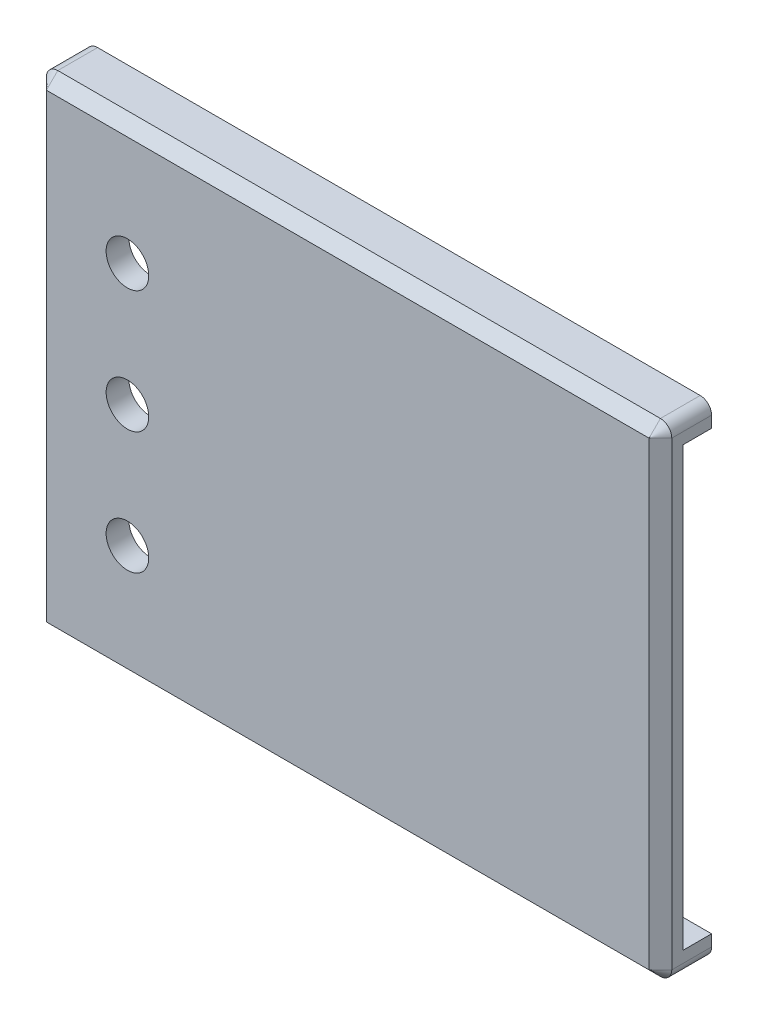
ISO-10303-21;
HEADER;
FILE_DESCRIPTION(('STEP AP214'),'2;1');
FILE_NAME('part.step','',(''),(''),'','','');
FILE_SCHEMA(('AUTOMOTIVE_DESIGN { 1 0 10303 214 1 1 1 1 }'));
ENDSEC;
DATA;
#1=APPLICATION_CONTEXT('core data for automotive mechanical design processes');
#2=APPLICATION_PROTOCOL_DEFINITION('international standard','automotive_design',2000,#1);
#3=PRODUCT_CONTEXT('',#1,'mechanical');
#4=PRODUCT('Part','Part','',(#3));
#5=PRODUCT_RELATED_PRODUCT_CATEGORY('part','',(#4));
#6=PRODUCT_DEFINITION_FORMATION('','',#4);
#7=PRODUCT_DEFINITION_CONTEXT('part definition',#1,'design');
#8=PRODUCT_DEFINITION('design','',#6,#7);
#9=PRODUCT_DEFINITION_SHAPE('','',#8);
#10=(LENGTH_UNIT() NAMED_UNIT(*) SI_UNIT(.MILLI.,.METRE.));
#11=(NAMED_UNIT(*) PLANE_ANGLE_UNIT() SI_UNIT($,.RADIAN.));
#12=(NAMED_UNIT(*) SI_UNIT($,.STERADIAN.) SOLID_ANGLE_UNIT());
#13=UNCERTAINTY_MEASURE_WITH_UNIT(LENGTH_MEASURE(1.E-05),#10,'distance_accuracy_value','');
#14=(GEOMETRIC_REPRESENTATION_CONTEXT(3) GLOBAL_UNCERTAINTY_ASSIGNED_CONTEXT((#13)) GLOBAL_UNIT_ASSIGNED_CONTEXT((#10,
#11,#12)) REPRESENTATION_CONTEXT('',''));
#15=CARTESIAN_POINT('',(0.,0.,0.));
#16=DIRECTION('',(0.,0.,1.));
#17=DIRECTION('',(1.,0.,0.));
#18=AXIS2_PLACEMENT_3D('',#15,#16,#17);
#19=CARTESIAN_POINT('',(0.,0.,26.));
#20=DIRECTION('',(0.,0.,1.));
#21=DIRECTION('',(1.,0.,0.));
#22=AXIS2_PLACEMENT_3D('',#19,#20,#21);
#23=PLANE('',#22);
#24=CARTESIAN_POINT('',(108.,2.,26.));
#25=DIRECTION('',(0.,0.,1.));
#26=DIRECTION('',(1.,0.,0.));
#27=AXIS2_PLACEMENT_3D('',#24,#25,#26);
#28=CIRCLE('',#27,2.);
#29=CARTESIAN_POINT('',(110.,2.,26.));
#30=VERTEX_POINT('',#29);
#31=CARTESIAN_POINT('',(108.,0.,26.));
#32=VERTEX_POINT('',#31);
#33=EDGE_CURVE('E39',#30,#32,#28,.F.);
#34=ORIENTED_EDGE('',*,*,#33,.T.);
#35=DIRECTION('',(1.,0.,0.));
#36=VECTOR('',#35,1.);
#37=CARTESIAN_POINT('',(0.,0.,26.));
#38=LINE('',#37,#36);
#39=CARTESIAN_POINT('',(2.,0.,26.));
#40=VERTEX_POINT('',#39);
#41=EDGE_CURVE('E264',#40,#32,#38,.T.);
#42=ORIENTED_EDGE('',*,*,#41,.F.);
#43=CARTESIAN_POINT('',(2.,2.,26.));
#44=DIRECTION('',(0.,0.,1.));
#45=DIRECTION('',(1.,0.,0.));
#46=AXIS2_PLACEMENT_3D('',#43,#44,#45);
#47=CIRCLE('',#46,2.);
#48=CARTESIAN_POINT('',(0.,2.,26.));
#49=VERTEX_POINT('',#48);
#50=EDGE_CURVE('E268',#40,#49,#47,.F.);
#51=ORIENTED_EDGE('',*,*,#50,.T.);
#52=DIRECTION('',(0.,-1.,0.));
#53=VECTOR('',#52,1.);
#54=CARTESIAN_POINT('',(0.,0.,26.));
#55=LINE('',#54,#53);
#56=CARTESIAN_POINT('',(0.,83.,26.));
#57=VERTEX_POINT('',#56);
#58=EDGE_CURVE('E258',#57,#49,#55,.T.);
#59=ORIENTED_EDGE('',*,*,#58,.F.);
#60=CARTESIAN_POINT('',(2.,83.,26.));
#61=DIRECTION('',(0.,0.,1.));
#62=DIRECTION('',(1.,0.,0.));
#63=AXIS2_PLACEMENT_3D('',#60,#61,#62);
#64=CIRCLE('',#63,2.);
#65=CARTESIAN_POINT('',(2.,85.,26.));
#66=VERTEX_POINT('',#65);
#67=EDGE_CURVE('E265',#57,#66,#64,.F.);
#68=ORIENTED_EDGE('',*,*,#67,.T.);
#69=DIRECTION('',(-1.,0.,0.));
#70=VECTOR('',#69,1.);
#71=CARTESIAN_POINT('',(0.,85.,26.));
#72=LINE('',#71,#70);
#73=CARTESIAN_POINT('',(108.,85.,26.));
#74=VERTEX_POINT('',#73);
#75=EDGE_CURVE('E262',#74,#66,#72,.T.);
#76=ORIENTED_EDGE('',*,*,#75,.F.);
#77=CARTESIAN_POINT('',(108.,83.,26.));
#78=DIRECTION('',(0.,0.,1.));
#79=DIRECTION('',(1.,0.,0.));
#80=AXIS2_PLACEMENT_3D('',#77,#78,#79);
#81=CIRCLE('',#80,2.);
#82=CARTESIAN_POINT('',(110.,83.,26.));
#83=VERTEX_POINT('',#82);
#84=EDGE_CURVE('E11',#74,#83,#81,.F.);
#85=ORIENTED_EDGE('',*,*,#84,.T.);
#86=DIRECTION('',(0.,1.,0.));
#87=VECTOR('',#86,1.);
#88=CARTESIAN_POINT('',(110.,0.,26.));
#89=LINE('',#88,#87);
#90=CARTESIAN_POINT('',(110.,81.,26.));
#91=VERTEX_POINT('',#90);
#92=EDGE_CURVE('E57',#91,#83,#89,.T.);
#93=ORIENTED_EDGE('',*,*,#92,.F.);
#94=DIRECTION('',(-1.,0.,0.));
#95=VECTOR('',#94,1.);
#96=CARTESIAN_POINT('',(0.,81.,26.));
#97=LINE('',#96,#95);
#98=CARTESIAN_POINT('',(4.,81.,26.));
#99=VERTEX_POINT('',#98);
#100=EDGE_CURVE('E259',#91,#99,#97,.T.);
#101=ORIENTED_EDGE('',*,*,#100,.T.);
#102=DIRECTION('',(0.,-1.,0.));
#103=VECTOR('',#102,1.);
#104=CARTESIAN_POINT('',(4.,0.,26.));
#105=LINE('',#104,#103);
#106=CARTESIAN_POINT('',(4.,4.,26.));
#107=VERTEX_POINT('',#106);
#108=EDGE_CURVE('E269',#99,#107,#105,.T.);
#109=ORIENTED_EDGE('',*,*,#108,.T.);
#110=DIRECTION('',(1.,0.,0.));
#111=VECTOR('',#110,1.);
#112=CARTESIAN_POINT('',(0.,4.,26.));
#113=LINE('',#112,#111);
#114=CARTESIAN_POINT('',(110.,4.,26.));
#115=VERTEX_POINT('',#114);
#116=EDGE_CURVE('E160',#107,#115,#113,.T.);
#117=ORIENTED_EDGE('',*,*,#116,.T.);
#118=EDGE_CURVE('E256',#30,#115,#89,.T.);
#119=ORIENTED_EDGE('',*,*,#118,.F.);
#120=EDGE_LOOP('',(#34,#42,#51,#59,#68,#76,#85,#93,#101,#109,#117,#119));
#121=FACE_BOUND('',#120,.T.);
#122=ADVANCED_FACE('F36',(#121),#23,.F.);
#123=CARTESIAN_POINT('',(0.,0.,35.));
#124=DIRECTION('',(0.,0.,-1.));
#125=DIRECTION('',(-1.,0.,0.));
#126=AXIS2_PLACEMENT_3D('',#123,#124,#125);
#127=PLANE('',#126);
#128=DIRECTION('',(1.,0.,0.));
#129=VECTOR('',#128,1.);
#130=CARTESIAN_POINT('',(0.,2.00000000000003,35.));
#131=LINE('',#130,#129);
#132=CARTESIAN_POINT('',(2.,2.00000000000003,35.));
#133=VERTEX_POINT('',#132);
#134=CARTESIAN_POINT('',(108.,2.00000000000003,35.));
#135=VERTEX_POINT('',#134);
#136=EDGE_CURVE('E204',#133,#135,#131,.T.);
#137=ORIENTED_EDGE('',*,*,#136,.T.);
#138=DIRECTION('',(0.,1.,0.));
#139=VECTOR('',#138,1.);
#140=CARTESIAN_POINT('',(108.,0.,35.));
#141=LINE('',#140,#139);
#142=CARTESIAN_POINT('',(108.,83.,35.));
#143=VERTEX_POINT('',#142);
#144=EDGE_CURVE('E210',#135,#143,#141,.T.);
#145=ORIENTED_EDGE('',*,*,#144,.T.);
#146=DIRECTION('',(-1.,0.,0.));
#147=VECTOR('',#146,1.);
#148=CARTESIAN_POINT('',(0.,83.,35.));
#149=LINE('',#148,#147);
#150=CARTESIAN_POINT('',(2.00000000000003,83.,35.));
#151=VERTEX_POINT('',#150);
#152=EDGE_CURVE('E208',#143,#151,#149,.T.);
#153=ORIENTED_EDGE('',*,*,#152,.T.);
#154=DIRECTION('',(0.,-1.,0.));
#155=VECTOR('',#154,1.);
#156=CARTESIAN_POINT('',(2.00000000000003,0.,35.));
#157=LINE('',#156,#155);
#158=EDGE_CURVE('E206',#151,#133,#157,.T.);
#159=ORIENTED_EDGE('',*,*,#158,.T.);
#160=EDGE_LOOP('',(#137,#145,#153,#159));
#161=FACE_BOUND('',#160,.T.);
#162=CARTESIAN_POINT('',(16.25,63.75,35.));
#163=DIRECTION('',(0.,0.,1.));
#164=DIRECTION('',(1.,0.,0.));
#165=AXIS2_PLACEMENT_3D('',#162,#163,#164);
#166=CIRCLE('',#165,3.75);
#167=CARTESIAN_POINT('',(20.,63.75,35.));
#168=VERTEX_POINT('',#167);
#169=EDGE_CURVE('E182',#168,#168,#166,.T.);
#170=ORIENTED_EDGE('',*,*,#169,.F.);
#171=EDGE_LOOP('',(#170));
#172=FACE_BOUND('',#171,.T.);
#173=CARTESIAN_POINT('',(16.25,42.25,35.));
#174=DIRECTION('',(0.,0.,1.));
#175=DIRECTION('',(1.,0.,0.));
#176=AXIS2_PLACEMENT_3D('',#173,#174,#175);
#177=CIRCLE('',#176,3.75);
#178=CARTESIAN_POINT('',(20.,42.25,35.));
#179=VERTEX_POINT('',#178);
#180=EDGE_CURVE('E580',#179,#179,#177,.T.);
#181=ORIENTED_EDGE('',*,*,#180,.F.);
#182=EDGE_LOOP('',(#181));
#183=FACE_BOUND('',#182,.T.);
#184=CARTESIAN_POINT('',(16.25,20.75,35.));
#185=DIRECTION('',(0.,0.,1.));
#186=DIRECTION('',(1.,0.,0.));
#187=AXIS2_PLACEMENT_3D('',#184,#185,#186);
#188=CIRCLE('',#187,3.75);
#189=CARTESIAN_POINT('',(20.,20.75,35.));
#190=VERTEX_POINT('',#189);
#191=EDGE_CURVE('E170',#190,#190,#188,.T.);
#192=ORIENTED_EDGE('',*,*,#191,.F.);
#193=EDGE_LOOP('',(#192));
#194=FACE_BOUND('',#193,.T.);
#195=ADVANCED_FACE('F301',(#161,#172,#183,#194),#127,.F.);
#196=CARTESIAN_POINT('',(16.25,20.75,30.));
#197=DIRECTION('',(0.,0.,1.));
#198=DIRECTION('',(1.,0.,0.));
#199=AXIS2_PLACEMENT_3D('',#196,#197,#198);
#200=CYLINDRICAL_SURFACE('',#199,3.75);
#201=CARTESIAN_POINT('',(16.25,20.75,31.));
#202=DIRECTION('',(0.,0.,-1.));
#203=DIRECTION('',(-1.,0.,0.));
#204=AXIS2_PLACEMENT_3D('',#201,#202,#203);
#205=CIRCLE('',#204,3.75);
#206=CARTESIAN_POINT('',(12.5,20.75,31.));
#207=VERTEX_POINT('',#206);
#208=EDGE_CURVE('E178',#207,#207,#205,.T.);
#209=ORIENTED_EDGE('',*,*,#208,.T.);
#210=EDGE_LOOP('',(#209));
#211=FACE_BOUND('',#210,.T.);
#212=ORIENTED_EDGE('',*,*,#191,.T.);
#213=EDGE_LOOP('',(#212));
#214=FACE_BOUND('',#213,.T.);
#215=ADVANCED_FACE('F357',(#211,#214),#200,.F.);
#216=CARTESIAN_POINT('',(16.25,42.25,30.));
#217=DIRECTION('',(0.,0.,1.));
#218=DIRECTION('',(1.,0.,0.));
#219=AXIS2_PLACEMENT_3D('',#216,#217,#218);
#220=CYLINDRICAL_SURFACE('',#219,3.75);
#221=CARTESIAN_POINT('',(16.25,42.25,31.));
#222=DIRECTION('',(0.,0.,-1.));
#223=DIRECTION('',(-1.,0.,0.));
#224=AXIS2_PLACEMENT_3D('',#221,#222,#223);
#225=CIRCLE('',#224,3.75);
#226=CARTESIAN_POINT('',(12.5,42.25,31.));
#227=VERTEX_POINT('',#226);
#228=EDGE_CURVE('E181',#227,#227,#225,.T.);
#229=ORIENTED_EDGE('',*,*,#228,.T.);
#230=EDGE_LOOP('',(#229));
#231=FACE_BOUND('',#230,.T.);
#232=ORIENTED_EDGE('',*,*,#180,.T.);
#233=EDGE_LOOP('',(#232));
#234=FACE_BOUND('',#233,.T.);
#235=ADVANCED_FACE('F549',(#231,#234),#220,.F.);
#236=CARTESIAN_POINT('',(16.25,63.75,30.));
#237=DIRECTION('',(0.,0.,1.));
#238=DIRECTION('',(1.,0.,0.));
#239=AXIS2_PLACEMENT_3D('',#236,#237,#238);
#240=CYLINDRICAL_SURFACE('',#239,3.75);
#241=CARTESIAN_POINT('',(16.25,63.75,31.));
#242=DIRECTION('',(0.,0.,-1.));
#243=DIRECTION('',(-1.,0.,0.));
#244=AXIS2_PLACEMENT_3D('',#241,#242,#243);
#245=CIRCLE('',#244,3.75);
#246=CARTESIAN_POINT('',(12.5,63.75,31.));
#247=VERTEX_POINT('',#246);
#248=EDGE_CURVE('E156',#247,#247,#245,.T.);
#249=ORIENTED_EDGE('',*,*,#248,.T.);
#250=EDGE_LOOP('',(#249));
#251=FACE_BOUND('',#250,.T.);
#252=ORIENTED_EDGE('',*,*,#169,.T.);
#253=EDGE_LOOP('',(#252));
#254=FACE_BOUND('',#253,.T.);
#255=ADVANCED_FACE('F418',(#251,#254),#240,.F.);
#256=CARTESIAN_POINT('',(0.,83.,35.));
#257=DIRECTION('',(0.,-0.70710678118655,-0.707106781186545));
#258=DIRECTION('',(-1.,0.,0.));
#259=AXIS2_PLACEMENT_3D('',#256,#257,#258);
#260=PLANE('',#259);
#261=DIRECTION('',(0.,-0.707106781186545,0.70710678118655));
#262=VECTOR('',#261,1.);
#263=CARTESIAN_POINT('',(2.,85.,33.));
#264=LINE('',#263,#262);
#265=CARTESIAN_POINT('',(2.,85.,33.));
#266=VERTEX_POINT('',#265);
#267=EDGE_CURVE('E244',#266,#151,#264,.T.);
#268=ORIENTED_EDGE('',*,*,#267,.T.);
#269=ORIENTED_EDGE('',*,*,#152,.F.);
#270=DIRECTION('',(0.,-0.707106781186545,0.70710678118655));
#271=VECTOR('',#270,1.);
#272=CARTESIAN_POINT('',(108.,85.,33.));
#273=LINE('',#272,#271);
#274=CARTESIAN_POINT('',(108.,85.,33.));
#275=VERTEX_POINT('',#274);
#276=EDGE_CURVE('E238',#275,#143,#273,.T.);
#277=ORIENTED_EDGE('',*,*,#276,.F.);
#278=DIRECTION('',(1.,0.,0.));
#279=VECTOR('',#278,1.);
#280=CARTESIAN_POINT('',(0.,85.,33.));
#281=LINE('',#280,#279);
#282=EDGE_CURVE('E216',#266,#275,#281,.T.);
#283=ORIENTED_EDGE('',*,*,#282,.F.);
#284=EDGE_LOOP('',(#268,#269,#277,#283));
#285=FACE_BOUND('',#284,.T.);
#286=ADVANCED_FACE('F330',(#285),#260,.F.);
#287=CARTESIAN_POINT('',(0.,2.00000000000003,35.));
#288=DIRECTION('',(0.,0.70710678118655,-0.707106781186545));
#289=DIRECTION('',(1.,0.,0.));
#290=AXIS2_PLACEMENT_3D('',#287,#288,#289);
#291=PLANE('',#290);
#292=DIRECTION('',(0.,-0.707106781186545,-0.70710678118655));
#293=VECTOR('',#292,1.);
#294=CARTESIAN_POINT('',(2.,2.00000000000003,35.));
#295=LINE('',#294,#293);
#296=CARTESIAN_POINT('',(2.,0.,33.));
#297=VERTEX_POINT('',#296);
#298=EDGE_CURVE('E247',#133,#297,#295,.T.);
#299=ORIENTED_EDGE('',*,*,#298,.T.);
#300=DIRECTION('',(-1.,0.,0.));
#301=VECTOR('',#300,1.);
#302=CARTESIAN_POINT('',(0.,0.,33.));
#303=LINE('',#302,#301);
#304=CARTESIAN_POINT('',(108.,0.,33.));
#305=VERTEX_POINT('',#304);
#306=EDGE_CURVE('E232',#305,#297,#303,.T.);
#307=ORIENTED_EDGE('',*,*,#306,.F.);
#308=DIRECTION('',(0.,-0.707106781186545,-0.70710678118655));
#309=VECTOR('',#308,1.);
#310=CARTESIAN_POINT('',(108.,2.00000000000003,35.));
#311=LINE('',#310,#309);
#312=EDGE_CURVE('E241',#135,#305,#311,.T.);
#313=ORIENTED_EDGE('',*,*,#312,.F.);
#314=ORIENTED_EDGE('',*,*,#136,.F.);
#315=EDGE_LOOP('',(#299,#307,#313,#314));
#316=FACE_BOUND('',#315,.T.);
#317=ADVANCED_FACE('F291',(#316),#291,.F.);
#318=CARTESIAN_POINT('',(2.00000000000003,0.,35.));
#319=DIRECTION('',(0.70710678118655,0.,-0.707106781186545));
#320=DIRECTION('',(0.,-1.,0.));
#321=AXIS2_PLACEMENT_3D('',#318,#319,#320);
#322=PLANE('',#321);
#323=DIRECTION('',(0.707106781186545,0.,0.70710678118655));
#324=VECTOR('',#323,1.);
#325=CARTESIAN_POINT('',(0.,83.,33.));
#326=LINE('',#325,#324);
#327=CARTESIAN_POINT('',(0.,83.,33.));
#328=VERTEX_POINT('',#327);
#329=EDGE_CURVE('E250',#328,#151,#326,.T.);
#330=ORIENTED_EDGE('',*,*,#329,.F.);
#331=DIRECTION('',(0.,1.,0.));
#332=VECTOR('',#331,1.);
#333=CARTESIAN_POINT('',(0.,0.,33.));
#334=LINE('',#333,#332);
#335=CARTESIAN_POINT('',(0.,2.,33.));
#336=VERTEX_POINT('',#335);
#337=EDGE_CURVE('E224',#336,#328,#334,.T.);
#338=ORIENTED_EDGE('',*,*,#337,.F.);
#339=DIRECTION('',(-0.707106781186545,0.,-0.70710678118655));
#340=VECTOR('',#339,1.);
#341=CARTESIAN_POINT('',(2.00000000000003,2.,35.));
#342=LINE('',#341,#340);
#343=EDGE_CURVE('E253',#133,#336,#342,.T.);
#344=ORIENTED_EDGE('',*,*,#343,.F.);
#345=ORIENTED_EDGE('',*,*,#158,.F.);
#346=EDGE_LOOP('',(#330,#338,#344,#345));
#347=FACE_BOUND('',#346,.T.);
#348=ADVANCED_FACE('F309',(#347),#322,.F.);
#349=CARTESIAN_POINT('',(108.,0.,35.));
#350=DIRECTION('',(-0.707106781186552,0.,-0.707106781186542));
#351=DIRECTION('',(0.,1.,0.));
#352=AXIS2_PLACEMENT_3D('',#349,#350,#351);
#353=PLANE('',#352);
#354=DIRECTION('',(0.70710678118654,0.,-0.707106781186555));
#355=VECTOR('',#354,1.);
#356=CARTESIAN_POINT('',(108.,2.,35.));
#357=LINE('',#356,#355);
#358=CARTESIAN_POINT('',(110.,2.,33.));
#359=VERTEX_POINT('',#358);
#360=EDGE_CURVE('E236',#135,#359,#357,.T.);
#361=ORIENTED_EDGE('',*,*,#360,.T.);
#362=DIRECTION('',(0.,-1.,0.));
#363=VECTOR('',#362,1.);
#364=CARTESIAN_POINT('',(110.,0.,33.));
#365=LINE('',#364,#363);
#366=CARTESIAN_POINT('',(110.,83.,33.));
#367=VERTEX_POINT('',#366);
#368=EDGE_CURVE('E213',#367,#359,#365,.T.);
#369=ORIENTED_EDGE('',*,*,#368,.F.);
#370=DIRECTION('',(-0.70710678118654,0.,0.707106781186555));
#371=VECTOR('',#370,1.);
#372=CARTESIAN_POINT('',(110.,83.,33.));
#373=LINE('',#372,#371);
#374=EDGE_CURVE('E234',#367,#143,#373,.T.);
#375=ORIENTED_EDGE('',*,*,#374,.T.);
#376=ORIENTED_EDGE('',*,*,#144,.F.);
#377=EDGE_LOOP('',(#361,#369,#375,#376));
#378=FACE_BOUND('',#377,.T.);
#379=ADVANCED_FACE('F298',(#378),#353,.F.);
#380=CARTESIAN_POINT('',(0.,81.,35.));
#381=DIRECTION('',(0.,-1.,0.));
#382=DIRECTION('',(0.,0.,-1.));
#383=AXIS2_PLACEMENT_3D('',#380,#381,#382);
#384=PLANE('',#383);
#385=ORIENTED_EDGE('',*,*,#100,.F.);
#386=DIRECTION('',(0.,0.,-1.));
#387=VECTOR('',#386,1.);
#388=CARTESIAN_POINT('',(110.,81.,35.));
#389=LINE('',#388,#387);
#390=CARTESIAN_POINT('',(110.,81.,31.));
#391=VERTEX_POINT('',#390);
#392=EDGE_CURVE('E167',#391,#91,#389,.T.);
#393=ORIENTED_EDGE('',*,*,#392,.F.);
#394=DIRECTION('',(-1.,0.,0.));
#395=VECTOR('',#394,1.);
#396=CARTESIAN_POINT('',(0.,81.,31.));
#397=LINE('',#396,#395);
#398=CARTESIAN_POINT('',(4.,81.,31.));
#399=VERTEX_POINT('',#398);
#400=EDGE_CURVE('E173',#391,#399,#397,.T.);
#401=ORIENTED_EDGE('',*,*,#400,.T.);
#402=DIRECTION('',(0.,0.,-1.));
#403=VECTOR('',#402,1.);
#404=CARTESIAN_POINT('',(4.,81.,35.));
#405=LINE('',#404,#403);
#406=EDGE_CURVE('E155',#399,#99,#405,.T.);
#407=ORIENTED_EDGE('',*,*,#406,.T.);
#408=EDGE_LOOP('',(#385,#393,#401,#407));
#409=FACE_BOUND('',#408,.T.);
#410=ADVANCED_FACE('F371',(#409),#384,.T.);
#411=CARTESIAN_POINT('',(0.,0.,31.));
#412=DIRECTION('',(0.,0.,-1.));
#413=DIRECTION('',(-1.,0.,0.));
#414=AXIS2_PLACEMENT_3D('',#411,#412,#413);
#415=PLANE('',#414);
#416=ORIENTED_EDGE('',*,*,#248,.F.);
#417=EDGE_LOOP('',(#416));
#418=FACE_BOUND('',#417,.T.);
#419=ORIENTED_EDGE('',*,*,#228,.F.);
#420=EDGE_LOOP('',(#419));
#421=FACE_BOUND('',#420,.T.);
#422=ORIENTED_EDGE('',*,*,#208,.F.);
#423=EDGE_LOOP('',(#422));
#424=FACE_BOUND('',#423,.T.);
#425=DIRECTION('',(0.,-1.,0.));
#426=VECTOR('',#425,1.);
#427=CARTESIAN_POINT('',(4.,0.,31.));
#428=LINE('',#427,#426);
#429=CARTESIAN_POINT('',(4.,4.,31.));
#430=VERTEX_POINT('',#429);
#431=EDGE_CURVE('E141',#399,#430,#428,.T.);
#432=ORIENTED_EDGE('',*,*,#431,.F.);
#433=ORIENTED_EDGE('',*,*,#400,.F.);
#434=DIRECTION('',(0.,1.,0.));
#435=VECTOR('',#434,1.);
#436=CARTESIAN_POINT('',(110.,0.,31.));
#437=LINE('',#436,#435);
#438=CARTESIAN_POINT('',(110.,4.,31.));
#439=VERTEX_POINT('',#438);
#440=EDGE_CURVE('E143',#439,#391,#437,.T.);
#441=ORIENTED_EDGE('',*,*,#440,.F.);
#442=DIRECTION('',(1.,0.,0.));
#443=VECTOR('',#442,1.);
#444=CARTESIAN_POINT('',(0.,4.,31.));
#445=LINE('',#444,#443);
#446=EDGE_CURVE('E137',#430,#439,#445,.T.);
#447=ORIENTED_EDGE('',*,*,#446,.F.);
#448=EDGE_LOOP('',(#432,#433,#441,#447));
#449=FACE_BOUND('',#448,.T.);
#450=ADVANCED_FACE('F139',(#418,#421,#424,#449),#415,.T.);
#451=CARTESIAN_POINT('',(0.,4.,35.));
#452=DIRECTION('',(0.,1.,0.));
#453=DIRECTION('',(0.,0.,1.));
#454=AXIS2_PLACEMENT_3D('',#451,#452,#453);
#455=PLANE('',#454);
#456=ORIENTED_EDGE('',*,*,#116,.F.);
#457=DIRECTION('',(0.,0.,-1.));
#458=VECTOR('',#457,1.);
#459=CARTESIAN_POINT('',(4.,4.,35.));
#460=LINE('',#459,#458);
#461=EDGE_CURVE('E153',#430,#107,#460,.T.);
#462=ORIENTED_EDGE('',*,*,#461,.F.);
#463=ORIENTED_EDGE('',*,*,#446,.T.);
#464=DIRECTION('',(0.,0.,-1.));
#465=VECTOR('',#464,1.);
#466=CARTESIAN_POINT('',(110.,4.,35.));
#467=LINE('',#466,#465);
#468=EDGE_CURVE('E163',#439,#115,#467,.T.);
#469=ORIENTED_EDGE('',*,*,#468,.T.);
#470=EDGE_LOOP('',(#456,#462,#463,#469));
#471=FACE_BOUND('',#470,.T.);
#472=ADVANCED_FACE('F158',(#471),#455,.T.);
#473=CARTESIAN_POINT('',(2.,83.,33.));
#474=DIRECTION('',(0.,0.,-1.));
#475=DIRECTION('',(-1.,0.,0.));
#476=AXIS2_PLACEMENT_3D('',#473,#474,#475);
#477=CONICAL_SURFACE('',#476,2.00000000000003,0.785398163397445);
#478=CARTESIAN_POINT('',(2.,83.,33.));
#479=DIRECTION('',(0.,0.,-1.));
#480=DIRECTION('',(-1.,0.,0.));
#481=AXIS2_PLACEMENT_3D('',#478,#479,#480);
#482=CIRCLE('',#481,2.);
#483=EDGE_CURVE('E218',#328,#266,#482,.T.);
#484=ORIENTED_EDGE('',*,*,#483,.F.);
#485=ORIENTED_EDGE('',*,*,#329,.T.);
#486=ORIENTED_EDGE('',*,*,#267,.F.);
#487=EDGE_LOOP('',(#484,#485,#486));
#488=FACE_BOUND('',#487,.T.);
#489=ADVANCED_FACE('F326',(#488),#477,.T.);
#490=CARTESIAN_POINT('',(0.,0.,35.));
#491=DIRECTION('',(1.,0.,0.));
#492=DIRECTION('',(0.,0.,-1.));
#493=AXIS2_PLACEMENT_3D('',#490,#491,#492);
#494=PLANE('',#493);
#495=DIRECTION('',(0.,0.,-1.));
#496=VECTOR('',#495,1.);
#497=CARTESIAN_POINT('',(0.,83.,35.));
#498=LINE('',#497,#496);
#499=EDGE_CURVE('E165',#328,#57,#498,.T.);
#500=ORIENTED_EDGE('',*,*,#499,.T.);
#501=ORIENTED_EDGE('',*,*,#58,.T.);
#502=DIRECTION('',(0.,0.,-1.));
#503=VECTOR('',#502,1.);
#504=CARTESIAN_POINT('',(0.,2.,35.));
#505=LINE('',#504,#503);
#506=EDGE_CURVE('E162',#49,#336,#505,.F.);
#507=ORIENTED_EDGE('',*,*,#506,.T.);
#508=ORIENTED_EDGE('',*,*,#337,.T.);
#509=EDGE_LOOP('',(#500,#501,#507,#508));
#510=FACE_BOUND('',#509,.T.);
#511=ADVANCED_FACE('F320',(#510),#494,.F.);
#512=CARTESIAN_POINT('',(2.,2.,33.));
#513=DIRECTION('',(0.,0.,-1.));
#514=DIRECTION('',(-1.,0.,0.));
#515=AXIS2_PLACEMENT_3D('',#512,#513,#514);
#516=CONICAL_SURFACE('',#515,2.00000000000003,0.785398163397445);
#517=ORIENTED_EDGE('',*,*,#343,.T.);
#518=CARTESIAN_POINT('',(2.,2.,33.));
#519=DIRECTION('',(0.,0.,-1.));
#520=DIRECTION('',(-1.,0.,0.));
#521=AXIS2_PLACEMENT_3D('',#518,#519,#520);
#522=CIRCLE('',#521,2.);
#523=EDGE_CURVE('E226',#297,#336,#522,.T.);
#524=ORIENTED_EDGE('',*,*,#523,.F.);
#525=ORIENTED_EDGE('',*,*,#298,.F.);
#526=EDGE_LOOP('',(#517,#524,#525));
#527=FACE_BOUND('',#526,.T.);
#528=ADVANCED_FACE('F312',(#527),#516,.T.);
#529=CARTESIAN_POINT('',(0.,0.,35.));
#530=DIRECTION('',(0.,1.,0.));
#531=DIRECTION('',(0.,0.,1.));
#532=AXIS2_PLACEMENT_3D('',#529,#530,#531);
#533=PLANE('',#532);
#534=DIRECTION('',(0.,0.,-1.));
#535=VECTOR('',#534,1.);
#536=CARTESIAN_POINT('',(2.,0.,35.));
#537=LINE('',#536,#535);
#538=EDGE_CURVE('E196',#297,#40,#537,.T.);
#539=ORIENTED_EDGE('',*,*,#538,.T.);
#540=ORIENTED_EDGE('',*,*,#41,.T.);
#541=DIRECTION('',(0.,0.,-1.));
#542=VECTOR('',#541,1.);
#543=CARTESIAN_POINT('',(108.,0.,35.));
#544=LINE('',#543,#542);
#545=EDGE_CURVE('E194',#32,#305,#544,.F.);
#546=ORIENTED_EDGE('',*,*,#545,.T.);
#547=ORIENTED_EDGE('',*,*,#306,.T.);
#548=EDGE_LOOP('',(#539,#540,#546,#547));
#549=FACE_BOUND('',#548,.T.);
#550=ADVANCED_FACE('F277',(#549),#533,.F.);
#551=CARTESIAN_POINT('',(108.,2.,33.));
#552=DIRECTION('',(0.,0.,-1.));
#553=DIRECTION('',(-1.,0.,0.));
#554=AXIS2_PLACEMENT_3D('',#551,#552,#553);
#555=CONICAL_SURFACE('',#554,2.00000000000003,0.785398163397445);
#556=ORIENTED_EDGE('',*,*,#312,.T.);
#557=CARTESIAN_POINT('',(108.,2.,33.));
#558=DIRECTION('',(0.,0.,-1.));
#559=DIRECTION('',(-1.,0.,0.));
#560=AXIS2_PLACEMENT_3D('',#557,#558,#559);
#561=CIRCLE('',#560,2.);
#562=EDGE_CURVE('E229',#359,#305,#561,.T.);
#563=ORIENTED_EDGE('',*,*,#562,.F.);
#564=ORIENTED_EDGE('',*,*,#360,.F.);
#565=EDGE_LOOP('',(#556,#563,#564));
#566=FACE_BOUND('',#565,.T.);
#567=ADVANCED_FACE('F294',(#566),#555,.T.);
#568=CARTESIAN_POINT('',(110.,0.,35.));
#569=DIRECTION('',(-1.,0.,0.));
#570=DIRECTION('',(0.,0.,1.));
#571=AXIS2_PLACEMENT_3D('',#568,#569,#570);
#572=PLANE('',#571);
#573=DIRECTION('',(0.,0.,-1.));
#574=VECTOR('',#573,1.);
#575=CARTESIAN_POINT('',(110.,2.,35.));
#576=LINE('',#575,#574);
#577=EDGE_CURVE('E201',#359,#30,#576,.T.);
#578=ORIENTED_EDGE('',*,*,#577,.T.);
#579=ORIENTED_EDGE('',*,*,#118,.T.);
#580=ORIENTED_EDGE('',*,*,#468,.F.);
#581=ORIENTED_EDGE('',*,*,#440,.T.);
#582=ORIENTED_EDGE('',*,*,#392,.T.);
#583=ORIENTED_EDGE('',*,*,#92,.T.);
#584=DIRECTION('',(0.,0.,-1.));
#585=VECTOR('',#584,1.);
#586=CARTESIAN_POINT('',(110.,83.,35.));
#587=LINE('',#586,#585);
#588=EDGE_CURVE('E199',#83,#367,#587,.F.);
#589=ORIENTED_EDGE('',*,*,#588,.T.);
#590=ORIENTED_EDGE('',*,*,#368,.T.);
#591=EDGE_LOOP('',(#578,#579,#580,#581,#582,#583,#589,#590));
#592=FACE_BOUND('',#591,.T.);
#593=ADVANCED_FACE('F338',(#592),#572,.F.);
#594=CARTESIAN_POINT('',(108.,83.,33.));
#595=DIRECTION('',(0.,0.,-1.));
#596=DIRECTION('',(-1.,0.,0.));
#597=AXIS2_PLACEMENT_3D('',#594,#595,#596);
#598=CONICAL_SURFACE('',#597,2.00000000000003,0.785398163397445);
#599=CARTESIAN_POINT('',(108.,83.,33.));
#600=DIRECTION('',(0.,0.,-1.));
#601=DIRECTION('',(-1.,0.,0.));
#602=AXIS2_PLACEMENT_3D('',#599,#600,#601);
#603=CIRCLE('',#602,2.);
#604=EDGE_CURVE('E221',#275,#367,#603,.T.);
#605=ORIENTED_EDGE('',*,*,#604,.F.);
#606=ORIENTED_EDGE('',*,*,#276,.T.);
#607=ORIENTED_EDGE('',*,*,#374,.F.);
#608=EDGE_LOOP('',(#605,#606,#607));
#609=FACE_BOUND('',#608,.T.);
#610=ADVANCED_FACE('F336',(#609),#598,.T.);
#611=CARTESIAN_POINT('',(0.,85.,35.));
#612=DIRECTION('',(0.,-1.,0.));
#613=DIRECTION('',(0.,0.,-1.));
#614=AXIS2_PLACEMENT_3D('',#611,#612,#613);
#615=PLANE('',#614);
#616=DIRECTION('',(0.,0.,-1.));
#617=VECTOR('',#616,1.);
#618=CARTESIAN_POINT('',(108.,85.,35.));
#619=LINE('',#618,#617);
#620=EDGE_CURVE('E189',#275,#74,#619,.T.);
#621=ORIENTED_EDGE('',*,*,#620,.T.);
#622=ORIENTED_EDGE('',*,*,#75,.T.);
#623=DIRECTION('',(0.,0.,-1.));
#624=VECTOR('',#623,1.);
#625=CARTESIAN_POINT('',(2.,85.,35.));
#626=LINE('',#625,#624);
#627=EDGE_CURVE('E192',#66,#266,#626,.F.);
#628=ORIENTED_EDGE('',*,*,#627,.T.);
#629=ORIENTED_EDGE('',*,*,#282,.T.);
#630=EDGE_LOOP('',(#621,#622,#628,#629));
#631=FACE_BOUND('',#630,.T.);
#632=ADVANCED_FACE('F333',(#631),#615,.F.);
#633=CARTESIAN_POINT('',(108.,83.,35.));
#634=DIRECTION('',(0.,0.,-1.));
#635=DIRECTION('',(-1.,0.,0.));
#636=AXIS2_PLACEMENT_3D('',#633,#634,#635);
#637=CYLINDRICAL_SURFACE('',#636,2.);
#638=ORIENTED_EDGE('',*,*,#84,.F.);
#639=ORIENTED_EDGE('',*,*,#620,.F.);
#640=ORIENTED_EDGE('',*,*,#604,.T.);
#641=ORIENTED_EDGE('',*,*,#588,.F.);
#642=EDGE_LOOP('',(#638,#639,#640,#641));
#643=FACE_BOUND('',#642,.T.);
#644=ADVANCED_FACE('F334',(#643),#637,.T.);
#645=CARTESIAN_POINT('',(108.,2.,35.));
#646=DIRECTION('',(0.,0.,-1.));
#647=DIRECTION('',(-1.,0.,0.));
#648=AXIS2_PLACEMENT_3D('',#645,#646,#647);
#649=CYLINDRICAL_SURFACE('',#648,2.);
#650=ORIENTED_EDGE('',*,*,#33,.F.);
#651=ORIENTED_EDGE('',*,*,#577,.F.);
#652=ORIENTED_EDGE('',*,*,#562,.T.);
#653=ORIENTED_EDGE('',*,*,#545,.F.);
#654=EDGE_LOOP('',(#650,#651,#652,#653));
#655=FACE_BOUND('',#654,.T.);
#656=ADVANCED_FACE('F284',(#655),#649,.T.);
#657=CARTESIAN_POINT('',(2.,2.,35.));
#658=DIRECTION('',(0.,0.,-1.));
#659=DIRECTION('',(-1.,0.,0.));
#660=AXIS2_PLACEMENT_3D('',#657,#658,#659);
#661=CYLINDRICAL_SURFACE('',#660,2.);
#662=ORIENTED_EDGE('',*,*,#50,.F.);
#663=ORIENTED_EDGE('',*,*,#538,.F.);
#664=ORIENTED_EDGE('',*,*,#523,.T.);
#665=ORIENTED_EDGE('',*,*,#506,.F.);
#666=EDGE_LOOP('',(#662,#663,#664,#665));
#667=FACE_BOUND('',#666,.T.);
#668=ADVANCED_FACE('F315',(#667),#661,.T.);
#669=CARTESIAN_POINT('',(2.,83.,35.));
#670=DIRECTION('',(0.,0.,-1.));
#671=DIRECTION('',(-1.,0.,0.));
#672=AXIS2_PLACEMENT_3D('',#669,#670,#671);
#673=CYLINDRICAL_SURFACE('',#672,2.);
#674=ORIENTED_EDGE('',*,*,#67,.F.);
#675=ORIENTED_EDGE('',*,*,#499,.F.);
#676=ORIENTED_EDGE('',*,*,#483,.T.);
#677=ORIENTED_EDGE('',*,*,#627,.F.);
#678=EDGE_LOOP('',(#674,#675,#676,#677));
#679=FACE_BOUND('',#678,.T.);
#680=ADVANCED_FACE('F322',(#679),#673,.T.);
#681=CARTESIAN_POINT('',(4.,0.,35.));
#682=DIRECTION('',(1.,0.,0.));
#683=DIRECTION('',(0.,0.,-1.));
#684=AXIS2_PLACEMENT_3D('',#681,#682,#683);
#685=PLANE('',#684);
#686=ORIENTED_EDGE('',*,*,#108,.F.);
#687=ORIENTED_EDGE('',*,*,#406,.F.);
#688=ORIENTED_EDGE('',*,*,#431,.T.);
#689=ORIENTED_EDGE('',*,*,#461,.T.);
#690=EDGE_LOOP('',(#686,#687,#688,#689));
#691=FACE_BOUND('',#690,.T.);
#692=ADVANCED_FACE('F152',(#691),#685,.T.);
#693=CLOSED_SHELL('',(#122,#195,#215,#235,#255,#286,#317,#348,#379,#410,#450,#472,#489,#511,
#528,#550,#567,#593,#610,#632,#644,#656,#668,#680,#692));
#694=MANIFOLD_SOLID_BREP('B2',#693);
#695=ADVANCED_BREP_SHAPE_REPRESENTATION('',(#18,#694),#14);
#696=SHAPE_DEFINITION_REPRESENTATION(#9,#695);
ENDSEC;
END-ISO-10303-21;
